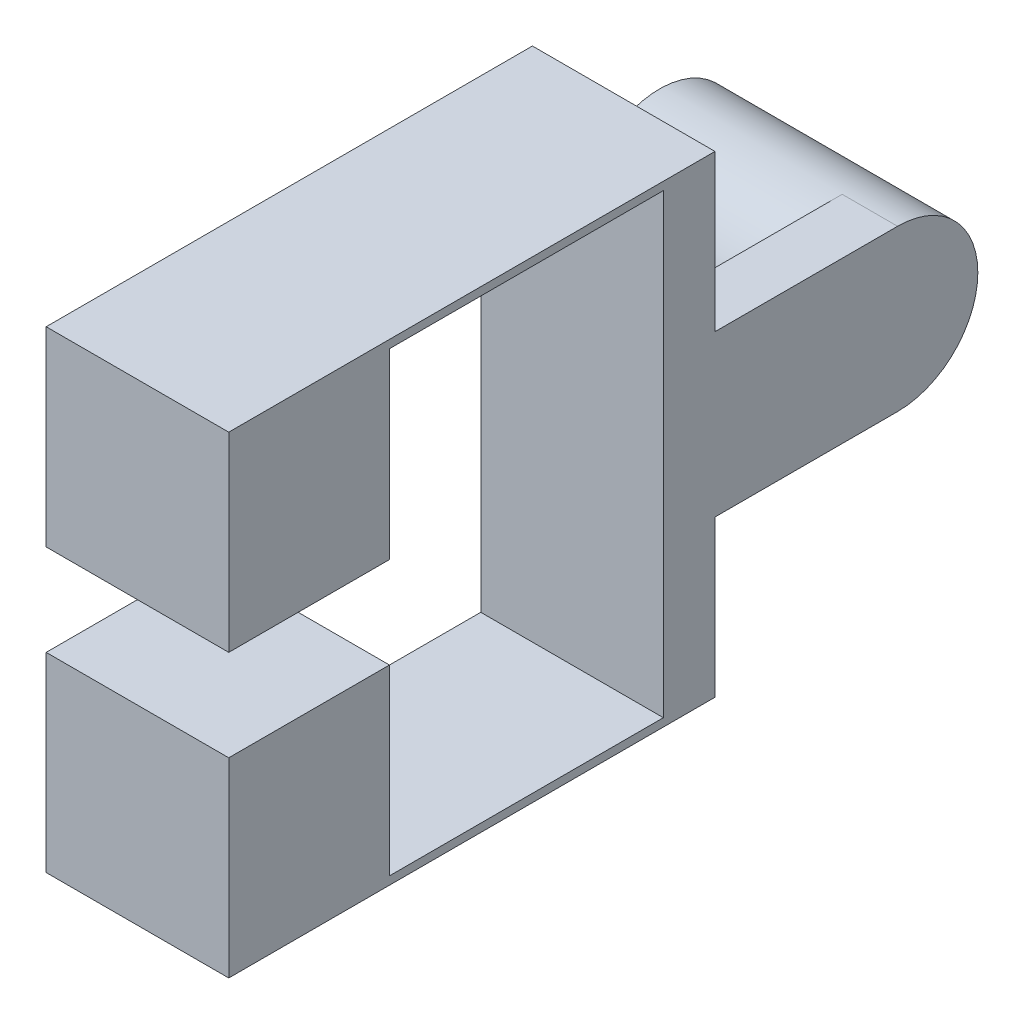
ISO-10303-21;
HEADER;
FILE_DESCRIPTION(('STEP AP214'),'2;1');
FILE_NAME('part.step','',(''),(''),'','','');
FILE_SCHEMA(('AUTOMOTIVE_DESIGN { 1 0 10303 214 1 1 1 1 }'));
ENDSEC;
DATA;
#1=APPLICATION_CONTEXT('core data for automotive mechanical design processes');
#2=APPLICATION_PROTOCOL_DEFINITION('international standard','automotive_design',2000,#1);
#3=PRODUCT_CONTEXT('',#1,'mechanical');
#4=PRODUCT('Part','Part','',(#3));
#5=PRODUCT_RELATED_PRODUCT_CATEGORY('part','',(#4));
#6=PRODUCT_DEFINITION_FORMATION('','',#4);
#7=PRODUCT_DEFINITION_CONTEXT('part definition',#1,'design');
#8=PRODUCT_DEFINITION('design','',#6,#7);
#9=PRODUCT_DEFINITION_SHAPE('','',#8);
#10=(LENGTH_UNIT() NAMED_UNIT(*) SI_UNIT(.MILLI.,.METRE.));
#11=(NAMED_UNIT(*) PLANE_ANGLE_UNIT() SI_UNIT($,.RADIAN.));
#12=(NAMED_UNIT(*) SI_UNIT($,.STERADIAN.) SOLID_ANGLE_UNIT());
#13=UNCERTAINTY_MEASURE_WITH_UNIT(LENGTH_MEASURE(1.E-05),#10,'distance_accuracy_value','');
#14=(GEOMETRIC_REPRESENTATION_CONTEXT(3) GLOBAL_UNCERTAINTY_ASSIGNED_CONTEXT((#13)) GLOBAL_UNIT_ASSIGNED_CONTEXT((#10,
#11,#12)) REPRESENTATION_CONTEXT('',''));
#15=CARTESIAN_POINT('',(0.,0.,0.));
#16=DIRECTION('',(0.,0.,1.));
#17=DIRECTION('',(1.,0.,0.));
#18=AXIS2_PLACEMENT_3D('',#15,#16,#17);
#19=CARTESIAN_POINT('',(7.70606793553884,11.1628049548617,0.));
#20=DIRECTION('',(-1.,0.,0.));
#21=DIRECTION('',(0.,0.,1.));
#22=AXIS2_PLACEMENT_3D('',#19,#20,#21);
#23=CYLINDRICAL_SURFACE('',#22,11.1628049548617);
#24=DIRECTION('',(-1.,0.,0.));
#25=VECTOR('',#24,1.);
#26=CARTESIAN_POINT('',(7.70606793553884,0.,0.));
#27=LINE('',#26,#25);
#28=CARTESIAN_POINT('',(7.70606793553884,0.,0.));
#29=VERTEX_POINT('',#28);
#30=CARTESIAN_POINT('',(0.,0.,0.));
#31=VERTEX_POINT('',#30);
#32=EDGE_CURVE('E267',#29,#31,#27,.T.);
#33=ORIENTED_EDGE('',*,*,#32,.T.);
#34=CARTESIAN_POINT('',(0.,11.1628049548617,0.));
#35=DIRECTION('',(-1.,0.,0.));
#36=DIRECTION('',(0.,0.,1.));
#37=AXIS2_PLACEMENT_3D('',#34,#35,#36);
#38=CIRCLE('',#37,11.1628049548617);
#39=CARTESIAN_POINT('',(0.,22.3256099097234,0.));
#40=VERTEX_POINT('',#39);
#41=EDGE_CURVE('E11',#31,#40,#38,.T.);
#42=ORIENTED_EDGE('',*,*,#41,.T.);
#43=DIRECTION('',(-1.,0.,0.));
#44=VECTOR('',#43,1.);
#45=CARTESIAN_POINT('',(7.70606793553884,22.3256099097234,0.));
#46=LINE('',#45,#44);
#47=CARTESIAN_POINT('',(7.70606793553884,22.3256099097234,0.));
#48=VERTEX_POINT('',#47);
#49=EDGE_CURVE('E42',#48,#40,#46,.T.);
#50=ORIENTED_EDGE('',*,*,#49,.F.);
#51=CARTESIAN_POINT('',(7.70606793553884,11.1628049548617,0.));
#52=DIRECTION('',(1.,0.,0.));
#53=DIRECTION('',(0.,0.,-1.));
#54=AXIS2_PLACEMENT_3D('',#51,#52,#53);
#55=CIRCLE('',#54,11.1628049548617);
#56=EDGE_CURVE('E261',#29,#48,#55,.T.);
#57=ORIENTED_EDGE('',*,*,#56,.F.);
#58=EDGE_LOOP('',(#33,#42,#50,#57));
#59=FACE_BOUND('',#58,.T.);
#60=CARTESIAN_POINT('',(-25.4,11.1628049548617,0.));
#61=DIRECTION('',(-1.,0.,0.));
#62=DIRECTION('',(0.,0.,1.));
#63=AXIS2_PLACEMENT_3D('',#60,#61,#62);
#64=CIRCLE('',#63,11.1628049548617);
#65=CARTESIAN_POINT('',(-25.4,11.1628049548617,11.1628049548617));
#66=VERTEX_POINT('',#65);
#67=EDGE_CURVE('E258',#66,#66,#64,.T.);
#68=ORIENTED_EDGE('',*,*,#67,.F.);
#69=EDGE_LOOP('',(#68));
#70=FACE_BOUND('',#69,.T.);
#71=ADVANCED_FACE('F41',(#59,#70),#23,.T.);
#72=CARTESIAN_POINT('',(7.70606793553884,22.3256099097234,0.));
#73=DIRECTION('',(0.,-1.,0.));
#74=DIRECTION('',(0.,0.,-1.));
#75=AXIS2_PLACEMENT_3D('',#72,#73,#74);
#76=PLANE('',#75);
#77=DIRECTION('',(0.,0.,1.));
#78=VECTOR('',#77,1.);
#79=CARTESIAN_POINT('',(0.,22.3256099097234,0.));
#80=LINE('',#79,#78);
#81=CARTESIAN_POINT('',(0.,22.3256099097234,25.4));
#82=VERTEX_POINT('',#81);
#83=EDGE_CURVE('E259',#40,#82,#80,.T.);
#84=ORIENTED_EDGE('',*,*,#83,.T.);
#85=DIRECTION('',(-1.,0.,0.));
#86=VECTOR('',#85,1.);
#87=CARTESIAN_POINT('',(7.70606793553884,22.3256099097234,25.4));
#88=LINE('',#87,#86);
#89=CARTESIAN_POINT('',(7.70606793553884,22.3256099097234,25.4));
#90=VERTEX_POINT('',#89);
#91=EDGE_CURVE('E278',#90,#82,#88,.T.);
#92=ORIENTED_EDGE('',*,*,#91,.F.);
#93=DIRECTION('',(0.,0.,1.));
#94=VECTOR('',#93,1.);
#95=CARTESIAN_POINT('',(7.70606793553884,22.3256099097234,0.));
#96=LINE('',#95,#94);
#97=EDGE_CURVE('E262',#48,#90,#96,.T.);
#98=ORIENTED_EDGE('',*,*,#97,.F.);
#99=ORIENTED_EDGE('',*,*,#49,.T.);
#100=EDGE_LOOP('',(#84,#92,#98,#99));
#101=FACE_BOUND('',#100,.T.);
#102=ADVANCED_FACE('F289',(#101),#76,.F.);
#103=CARTESIAN_POINT('',(7.70606793553884,0.,0.));
#104=DIRECTION('',(0.,1.,0.));
#105=DIRECTION('',(0.,0.,1.));
#106=AXIS2_PLACEMENT_3D('',#103,#104,#105);
#107=PLANE('',#106);
#108=DIRECTION('',(0.,0.,-1.));
#109=VECTOR('',#108,1.);
#110=CARTESIAN_POINT('',(0.,0.,0.));
#111=LINE('',#110,#109);
#112=CARTESIAN_POINT('',(0.,0.,25.4));
#113=VERTEX_POINT('',#112);
#114=EDGE_CURVE('E264',#113,#31,#111,.T.);
#115=ORIENTED_EDGE('',*,*,#114,.T.);
#116=ORIENTED_EDGE('',*,*,#32,.F.);
#117=DIRECTION('',(0.,0.,-1.));
#118=VECTOR('',#117,1.);
#119=CARTESIAN_POINT('',(7.70606793553884,0.,0.));
#120=LINE('',#119,#118);
#121=CARTESIAN_POINT('',(7.70606793553884,0.,25.4));
#122=VERTEX_POINT('',#121);
#123=EDGE_CURVE('E270',#122,#29,#120,.T.);
#124=ORIENTED_EDGE('',*,*,#123,.F.);
#125=DIRECTION('',(-1.,0.,0.));
#126=VECTOR('',#125,1.);
#127=CARTESIAN_POINT('',(7.70606793553884,0.,25.4));
#128=LINE('',#127,#126);
#129=EDGE_CURVE('E276',#122,#113,#128,.T.);
#130=ORIENTED_EDGE('',*,*,#129,.T.);
#131=EDGE_LOOP('',(#115,#116,#124,#130));
#132=FACE_BOUND('',#131,.T.);
#133=ADVANCED_FACE('F296',(#132),#107,.F.);
#134=CARTESIAN_POINT('',(7.70606793553884,11.1628049548617,0.));
#135=DIRECTION('',(1.,0.,0.));
#136=DIRECTION('',(0.,0.,-1.));
#137=AXIS2_PLACEMENT_3D('',#134,#135,#136);
#138=PLANE('',#137);
#139=ORIENTED_EDGE('',*,*,#56,.T.);
#140=ORIENTED_EDGE('',*,*,#97,.T.);
#141=DIRECTION('',(0.,1.,0.));
#142=VECTOR('',#141,1.);
#143=CARTESIAN_POINT('',(7.70606793553884,-21.7160839340272,25.4));
#144=LINE('',#143,#142);
#145=CARTESIAN_POINT('',(7.70606793553884,44.0416938437506,25.4));
#146=VERTEX_POINT('',#145);
#147=EDGE_CURVE('E247',#90,#146,#144,.T.);
#148=ORIENTED_EDGE('',*,*,#147,.T.);
#149=DIRECTION('',(0.,0.,1.));
#150=VECTOR('',#149,1.);
#151=CARTESIAN_POINT('',(7.70606793553884,44.0416938437506,25.4));
#152=LINE('',#151,#150);
#153=CARTESIAN_POINT('',(7.70606793553884,44.0416938437506,93.0390430114075));
#154=VERTEX_POINT('',#153);
#155=EDGE_CURVE('E248',#146,#154,#152,.T.);
#156=ORIENTED_EDGE('',*,*,#155,.T.);
#157=DIRECTION('',(0.,1.,0.));
#158=VECTOR('',#157,1.);
#159=CARTESIAN_POINT('',(7.70606793553884,44.0416938437506,93.0390430114075));
#160=LINE('',#159,#158);
#161=CARTESIAN_POINT('',(7.70606793553884,17.5128049548617,93.0390430114075));
#162=VERTEX_POINT('',#161);
#163=EDGE_CURVE('E213',#162,#154,#160,.T.);
#164=ORIENTED_EDGE('',*,*,#163,.F.);
#165=DIRECTION('',(0.,0.,-1.));
#166=VECTOR('',#165,1.);
#167=CARTESIAN_POINT('',(7.70606793553884,17.5128049548617,93.0390430114075));
#168=LINE('',#167,#166);
#169=CARTESIAN_POINT('',(7.70606793553884,17.5128049548617,70.6842048968553));
#170=VERTEX_POINT('',#169);
#171=EDGE_CURVE('E199',#162,#170,#168,.T.);
#172=ORIENTED_EDGE('',*,*,#171,.T.);
#173=DIRECTION('',(0.,1.,0.));
#174=VECTOR('',#173,1.);
#175=CARTESIAN_POINT('',(7.70606793553884,44.0416938437506,70.6842048968553));
#176=LINE('',#175,#174);
#177=CARTESIAN_POINT('',(7.70606793553884,42.9128049548617,70.6842048968553));
#178=VERTEX_POINT('',#177);
#179=EDGE_CURVE('E204',#170,#178,#176,.T.);
#180=ORIENTED_EDGE('',*,*,#179,.T.);
#181=DIRECTION('',(0.,0.,-1.));
#182=VECTOR('',#181,1.);
#183=CARTESIAN_POINT('',(7.70606793553884,42.9128049548617,70.6842048968553));
#184=LINE('',#183,#182);
#185=CARTESIAN_POINT('',(7.70606793553884,42.9128049548617,32.5842048968553));
#186=VERTEX_POINT('',#185);
#187=EDGE_CURVE('E235',#178,#186,#184,.T.);
#188=ORIENTED_EDGE('',*,*,#187,.T.);
#189=DIRECTION('',(0.,-1.,0.));
#190=VECTOR('',#189,1.);
#191=CARTESIAN_POINT('',(7.70606793553884,-21.7160839340272,32.5842048968553));
#192=LINE('',#191,#190);
#193=CARTESIAN_POINT('',(7.70606793553884,-20.5871950451383,32.5842048968553));
#194=VERTEX_POINT('',#193);
#195=EDGE_CURVE('E163',#186,#194,#192,.T.);
#196=ORIENTED_EDGE('',*,*,#195,.T.);
#197=DIRECTION('',(0.,0.,-1.));
#198=VECTOR('',#197,1.);
#199=CARTESIAN_POINT('',(7.70606793553884,-20.5871950451383,70.6842048968553));
#200=LINE('',#199,#198);
#201=CARTESIAN_POINT('',(7.70606793553884,-20.5871950451383,70.6842048968553));
#202=VERTEX_POINT('',#201);
#203=EDGE_CURVE('E226',#202,#194,#200,.T.);
#204=ORIENTED_EDGE('',*,*,#203,.F.);
#205=DIRECTION('',(0.,1.,0.));
#206=VECTOR('',#205,1.);
#207=CARTESIAN_POINT('',(7.70606793553884,-21.7160839340272,70.6842048968553));
#208=LINE('',#207,#206);
#209=CARTESIAN_POINT('',(7.70606793553884,4.81280495486169,70.6842048968553));
#210=VERTEX_POINT('',#209);
#211=EDGE_CURVE('E182',#202,#210,#208,.T.);
#212=ORIENTED_EDGE('',*,*,#211,.T.);
#213=DIRECTION('',(0.,0.,-1.));
#214=VECTOR('',#213,1.);
#215=CARTESIAN_POINT('',(7.70606793553884,4.81280495486169,93.0390430114075));
#216=LINE('',#215,#214);
#217=CARTESIAN_POINT('',(7.70606793553884,4.81280495486169,93.0390430114075));
#218=VERTEX_POINT('',#217);
#219=EDGE_CURVE('E194',#218,#210,#216,.T.);
#220=ORIENTED_EDGE('',*,*,#219,.F.);
#221=DIRECTION('',(0.,1.,0.));
#222=VECTOR('',#221,1.);
#223=CARTESIAN_POINT('',(7.70606793553884,-21.7160839340272,93.0390430114075));
#224=LINE('',#223,#222);
#225=CARTESIAN_POINT('',(7.70606793553884,-21.7160839340272,93.0390430114075));
#226=VERTEX_POINT('',#225);
#227=EDGE_CURVE('E175',#226,#218,#224,.T.);
#228=ORIENTED_EDGE('',*,*,#227,.F.);
#229=DIRECTION('',(0.,0.,-1.));
#230=VECTOR('',#229,1.);
#231=CARTESIAN_POINT('',(7.70606793553884,-21.7160839340272,25.4));
#232=LINE('',#231,#230);
#233=CARTESIAN_POINT('',(7.70606793553884,-21.7160839340272,25.4));
#234=VERTEX_POINT('',#233);
#235=EDGE_CURVE('E168',#226,#234,#232,.T.);
#236=ORIENTED_EDGE('',*,*,#235,.T.);
#237=EDGE_CURVE('E250',#234,#122,#144,.T.);
#238=ORIENTED_EDGE('',*,*,#237,.T.);
#239=ORIENTED_EDGE('',*,*,#123,.T.);
#240=EDGE_LOOP('',(#139,#140,#148,#156,#164,#172,#180,#188,#196,#204,#212,#220,#228,#236,#238,#239));
#241=FACE_BOUND('',#240,.T.);
#242=ADVANCED_FACE('F305',(#241),#138,.T.);
#243=CARTESIAN_POINT('',(0.,11.1628049548617,0.));
#244=DIRECTION('',(1.,0.,0.));
#245=DIRECTION('',(0.,0.,-1.));
#246=AXIS2_PLACEMENT_3D('',#243,#244,#245);
#247=PLANE('',#246);
#248=ORIENTED_EDGE('',*,*,#41,.F.);
#249=ORIENTED_EDGE('',*,*,#114,.F.);
#250=DIRECTION('',(0.,-1.,0.));
#251=VECTOR('',#250,1.);
#252=CARTESIAN_POINT('',(0.,0.,25.4));
#253=LINE('',#252,#251);
#254=EDGE_CURVE('E275',#82,#113,#253,.T.);
#255=ORIENTED_EDGE('',*,*,#254,.F.);
#256=ORIENTED_EDGE('',*,*,#83,.F.);
#257=EDGE_LOOP('',(#248,#249,#255,#256));
#258=FACE_BOUND('',#257,.T.);
#259=ADVANCED_FACE('F295',(#258),#247,.F.);
#260=CARTESIAN_POINT('',(-25.4,11.1628049548617,0.));
#261=DIRECTION('',(-1.,0.,0.));
#262=DIRECTION('',(0.,0.,1.));
#263=AXIS2_PLACEMENT_3D('',#260,#261,#262);
#264=PLANE('',#263);
#265=ORIENTED_EDGE('',*,*,#67,.T.);
#266=EDGE_LOOP('',(#265));
#267=FACE_BOUND('',#266,.T.);
#268=ADVANCED_FACE('F360',(#267),#264,.T.);
#269=CARTESIAN_POINT('',(-17.6939320644612,-21.7160839340272,25.4));
#270=DIRECTION('',(0.,0.,-1.));
#271=DIRECTION('',(-1.,0.,0.));
#272=AXIS2_PLACEMENT_3D('',#269,#270,#271);
#273=PLANE('',#272);
#274=ORIENTED_EDGE('',*,*,#129,.F.);
#275=ORIENTED_EDGE('',*,*,#237,.F.);
#276=DIRECTION('',(1.,0.,0.));
#277=VECTOR('',#276,1.);
#278=CARTESIAN_POINT('',(-17.6939320644612,-21.7160839340272,25.4));
#279=LINE('',#278,#277);
#280=CARTESIAN_POINT('',(-17.6939320644612,-21.7160839340272,25.4));
#281=VERTEX_POINT('',#280);
#282=EDGE_CURVE('E243',#281,#234,#279,.T.);
#283=ORIENTED_EDGE('',*,*,#282,.F.);
#284=DIRECTION('',(0.,1.,0.));
#285=VECTOR('',#284,1.);
#286=CARTESIAN_POINT('',(-17.6939320644612,-21.7160839340272,25.4));
#287=LINE('',#286,#285);
#288=CARTESIAN_POINT('',(-17.6939320644612,44.0416938437506,25.4));
#289=VERTEX_POINT('',#288);
#290=EDGE_CURVE('E165',#281,#289,#287,.T.);
#291=ORIENTED_EDGE('',*,*,#290,.T.);
#292=DIRECTION('',(1.,0.,0.));
#293=VECTOR('',#292,1.);
#294=CARTESIAN_POINT('',(-17.6939320644612,44.0416938437506,25.4));
#295=LINE('',#294,#293);
#296=EDGE_CURVE('E251',#289,#146,#295,.T.);
#297=ORIENTED_EDGE('',*,*,#296,.T.);
#298=ORIENTED_EDGE('',*,*,#147,.F.);
#299=ORIENTED_EDGE('',*,*,#91,.T.);
#300=ORIENTED_EDGE('',*,*,#254,.T.);
#301=EDGE_LOOP('',(#274,#275,#283,#291,#297,#298,#299,#300));
#302=FACE_BOUND('',#301,.T.);
#303=ADVANCED_FACE('F298',(#302),#273,.T.);
#304=CARTESIAN_POINT('',(-17.6939320644612,-21.7160839340272,25.4));
#305=DIRECTION('',(0.,-1.,0.));
#306=DIRECTION('',(0.,0.,-1.));
#307=AXIS2_PLACEMENT_3D('',#304,#305,#306);
#308=PLANE('',#307);
#309=ORIENTED_EDGE('',*,*,#235,.F.);
#310=DIRECTION('',(1.,0.,0.));
#311=VECTOR('',#310,1.);
#312=CARTESIAN_POINT('',(-17.6939320644612,-21.7160839340272,93.0390430114075));
#313=LINE('',#312,#311);
#314=CARTESIAN_POINT('',(-17.6939320644612,-21.7160839340272,93.0390430114075));
#315=VERTEX_POINT('',#314);
#316=EDGE_CURVE('E170',#315,#226,#313,.T.);
#317=ORIENTED_EDGE('',*,*,#316,.F.);
#318=DIRECTION('',(0.,0.,-1.));
#319=VECTOR('',#318,1.);
#320=CARTESIAN_POINT('',(-17.6939320644612,-21.7160839340272,25.4));
#321=LINE('',#320,#319);
#322=EDGE_CURVE('E152',#315,#281,#321,.T.);
#323=ORIENTED_EDGE('',*,*,#322,.T.);
#324=ORIENTED_EDGE('',*,*,#282,.T.);
#325=EDGE_LOOP('',(#309,#317,#323,#324));
#326=FACE_BOUND('',#325,.T.);
#327=ADVANCED_FACE('F169',(#326),#308,.T.);
#328=CARTESIAN_POINT('',(-17.6939320644612,-21.7160839340272,32.5842048968553));
#329=DIRECTION('',(0.,0.,1.));
#330=DIRECTION('',(1.,0.,0.));
#331=AXIS2_PLACEMENT_3D('',#328,#329,#330);
#332=PLANE('',#331);
#333=DIRECTION('',(-1.,0.,0.));
#334=VECTOR('',#333,1.);
#335=CARTESIAN_POINT('',(7.70606793553884,-20.5871950451383,32.5842048968553));
#336=LINE('',#335,#334);
#337=CARTESIAN_POINT('',(-17.6939320644612,-20.5871950451383,32.5842048968553));
#338=VERTEX_POINT('',#337);
#339=EDGE_CURVE('E64',#194,#338,#336,.T.);
#340=ORIENTED_EDGE('',*,*,#339,.F.);
#341=ORIENTED_EDGE('',*,*,#195,.F.);
#342=DIRECTION('',(1.,0.,0.));
#343=VECTOR('',#342,1.);
#344=CARTESIAN_POINT('',(-17.6939320644612,42.9128049548617,32.5842048968553));
#345=LINE('',#344,#343);
#346=CARTESIAN_POINT('',(-17.6939320644612,42.9128049548617,32.5842048968553));
#347=VERTEX_POINT('',#346);
#348=EDGE_CURVE('E57',#347,#186,#345,.T.);
#349=ORIENTED_EDGE('',*,*,#348,.F.);
#350=DIRECTION('',(0.,-1.,0.));
#351=VECTOR('',#350,1.);
#352=CARTESIAN_POINT('',(-17.6939320644612,-21.7160839340272,32.5842048968553));
#353=LINE('',#352,#351);
#354=EDGE_CURVE('E241',#347,#338,#353,.T.);
#355=ORIENTED_EDGE('',*,*,#354,.T.);
#356=EDGE_LOOP('',(#340,#341,#349,#355));
#357=FACE_BOUND('',#356,.T.);
#358=ADVANCED_FACE('F314',(#357),#332,.T.);
#359=CARTESIAN_POINT('',(-17.6939320644612,44.0416938437506,25.4));
#360=DIRECTION('',(0.,1.,0.));
#361=DIRECTION('',(0.,0.,1.));
#362=AXIS2_PLACEMENT_3D('',#359,#360,#361);
#363=PLANE('',#362);
#364=ORIENTED_EDGE('',*,*,#155,.F.);
#365=ORIENTED_EDGE('',*,*,#296,.F.);
#366=DIRECTION('',(0.,0.,1.));
#367=VECTOR('',#366,1.);
#368=CARTESIAN_POINT('',(-17.6939320644612,44.0416938437506,25.4));
#369=LINE('',#368,#367);
#370=CARTESIAN_POINT('',(-17.6939320644612,44.0416938437506,93.0390430114075));
#371=VERTEX_POINT('',#370);
#372=EDGE_CURVE('E238',#289,#371,#369,.T.);
#373=ORIENTED_EDGE('',*,*,#372,.T.);
#374=DIRECTION('',(-1.,0.,0.));
#375=VECTOR('',#374,1.);
#376=CARTESIAN_POINT('',(-17.6939320644612,44.0416938437506,93.0390430114075));
#377=LINE('',#376,#375);
#378=EDGE_CURVE('E201',#154,#371,#377,.T.);
#379=ORIENTED_EDGE('',*,*,#378,.F.);
#380=EDGE_LOOP('',(#364,#365,#373,#379));
#381=FACE_BOUND('',#380,.T.);
#382=ADVANCED_FACE('F331',(#381),#363,.T.);
#383=CARTESIAN_POINT('',(-17.6939320644612,0.,0.));
#384=DIRECTION('',(-1.,0.,0.));
#385=DIRECTION('',(0.,0.,1.));
#386=AXIS2_PLACEMENT_3D('',#383,#384,#385);
#387=PLANE('',#386);
#388=ORIENTED_EDGE('',*,*,#322,.F.);
#389=DIRECTION('',(0.,-1.,0.));
#390=VECTOR('',#389,1.);
#391=CARTESIAN_POINT('',(-17.6939320644612,-21.7160839340272,93.0390430114075));
#392=LINE('',#391,#390);
#393=CARTESIAN_POINT('',(-17.6939320644612,4.81280495486169,93.0390430114075));
#394=VERTEX_POINT('',#393);
#395=EDGE_CURVE('E157',#394,#315,#392,.T.);
#396=ORIENTED_EDGE('',*,*,#395,.F.);
#397=DIRECTION('',(0.,0.,-1.));
#398=VECTOR('',#397,1.);
#399=CARTESIAN_POINT('',(-17.6939320644612,4.81280495486169,93.0390430114075));
#400=LINE('',#399,#398);
#401=CARTESIAN_POINT('',(-17.6939320644612,4.81280495486169,70.6842048968553));
#402=VERTEX_POINT('',#401);
#403=EDGE_CURVE('E189',#394,#402,#400,.T.);
#404=ORIENTED_EDGE('',*,*,#403,.T.);
#405=DIRECTION('',(0.,-1.,0.));
#406=VECTOR('',#405,1.);
#407=CARTESIAN_POINT('',(-17.6939320644612,-21.7160839340272,70.6842048968553));
#408=LINE('',#407,#406);
#409=CARTESIAN_POINT('',(-17.6939320644612,-20.5871950451383,70.6842048968553));
#410=VERTEX_POINT('',#409);
#411=EDGE_CURVE('E186',#402,#410,#408,.T.);
#412=ORIENTED_EDGE('',*,*,#411,.T.);
#413=DIRECTION('',(0.,0.,-1.));
#414=VECTOR('',#413,1.);
#415=CARTESIAN_POINT('',(-17.6939320644612,-20.5871950451383,70.6842048968553));
#416=LINE('',#415,#414);
#417=EDGE_CURVE('E224',#410,#338,#416,.T.);
#418=ORIENTED_EDGE('',*,*,#417,.T.);
#419=ORIENTED_EDGE('',*,*,#354,.F.);
#420=DIRECTION('',(0.,0.,-1.));
#421=VECTOR('',#420,1.);
#422=CARTESIAN_POINT('',(-17.6939320644612,42.9128049548617,70.6842048968553));
#423=LINE('',#422,#421);
#424=CARTESIAN_POINT('',(-17.6939320644612,42.9128049548617,70.6842048968553));
#425=VERTEX_POINT('',#424);
#426=EDGE_CURVE('E198',#425,#347,#423,.T.);
#427=ORIENTED_EDGE('',*,*,#426,.F.);
#428=DIRECTION('',(0.,-1.,0.));
#429=VECTOR('',#428,1.);
#430=CARTESIAN_POINT('',(-17.6939320644612,44.0416938437506,70.6842048968553));
#431=LINE('',#430,#429);
#432=CARTESIAN_POINT('',(-17.6939320644612,17.5128049548617,70.6842048968553));
#433=VERTEX_POINT('',#432);
#434=EDGE_CURVE('E187',#425,#433,#431,.T.);
#435=ORIENTED_EDGE('',*,*,#434,.T.);
#436=DIRECTION('',(0.,0.,-1.));
#437=VECTOR('',#436,1.);
#438=CARTESIAN_POINT('',(-17.6939320644612,17.5128049548617,93.0390430114075));
#439=LINE('',#438,#437);
#440=CARTESIAN_POINT('',(-17.6939320644612,17.5128049548617,93.0390430114075));
#441=VERTEX_POINT('',#440);
#442=EDGE_CURVE('E197',#441,#433,#439,.T.);
#443=ORIENTED_EDGE('',*,*,#442,.F.);
#444=DIRECTION('',(0.,-1.,0.));
#445=VECTOR('',#444,1.);
#446=CARTESIAN_POINT('',(-17.6939320644612,44.0416938437506,93.0390430114075));
#447=LINE('',#446,#445);
#448=EDGE_CURVE('E208',#371,#441,#447,.T.);
#449=ORIENTED_EDGE('',*,*,#448,.F.);
#450=ORIENTED_EDGE('',*,*,#372,.F.);
#451=ORIENTED_EDGE('',*,*,#290,.F.);
#452=EDGE_LOOP('',(#388,#396,#404,#412,#418,#419,#427,#435,#443,#449,#450,#451));
#453=FACE_BOUND('',#452,.T.);
#454=ADVANCED_FACE('F156',(#453),#387,.T.);
#455=CARTESIAN_POINT('',(-17.6939320644612,42.9128049548617,70.6842048968553));
#456=DIRECTION('',(0.,1.,0.));
#457=DIRECTION('',(0.,0.,1.));
#458=AXIS2_PLACEMENT_3D('',#455,#456,#457);
#459=PLANE('',#458);
#460=ORIENTED_EDGE('',*,*,#348,.T.);
#461=ORIENTED_EDGE('',*,*,#187,.F.);
#462=DIRECTION('',(1.,0.,0.));
#463=VECTOR('',#462,1.);
#464=CARTESIAN_POINT('',(-17.6939320644612,42.9128049548617,70.6842048968553));
#465=LINE('',#464,#463);
#466=EDGE_CURVE('E233',#425,#178,#465,.T.);
#467=ORIENTED_EDGE('',*,*,#466,.F.);
#468=ORIENTED_EDGE('',*,*,#426,.T.);
#469=EDGE_LOOP('',(#460,#461,#467,#468));
#470=FACE_BOUND('',#469,.T.);
#471=ADVANCED_FACE('F316',(#470),#459,.F.);
#472=CARTESIAN_POINT('',(7.70606793553884,-20.5871950451383,70.6842048968553));
#473=DIRECTION('',(0.,-1.,0.));
#474=DIRECTION('',(0.,0.,-1.));
#475=AXIS2_PLACEMENT_3D('',#472,#473,#474);
#476=PLANE('',#475);
#477=ORIENTED_EDGE('',*,*,#339,.T.);
#478=ORIENTED_EDGE('',*,*,#417,.F.);
#479=DIRECTION('',(-1.,0.,0.));
#480=VECTOR('',#479,1.);
#481=CARTESIAN_POINT('',(7.70606793553884,-20.5871950451383,70.6842048968553));
#482=LINE('',#481,#480);
#483=EDGE_CURVE('E219',#202,#410,#482,.T.);
#484=ORIENTED_EDGE('',*,*,#483,.F.);
#485=ORIENTED_EDGE('',*,*,#203,.T.);
#486=EDGE_LOOP('',(#477,#478,#484,#485));
#487=FACE_BOUND('',#486,.T.);
#488=ADVANCED_FACE('F311',(#487),#476,.F.);
#489=CARTESIAN_POINT('',(-17.6939320644612,4.81280495486169,93.0390430114075));
#490=DIRECTION('',(0.,-1.,0.));
#491=DIRECTION('',(0.,0.,-1.));
#492=AXIS2_PLACEMENT_3D('',#489,#490,#491);
#493=PLANE('',#492);
#494=DIRECTION('',(-1.,0.,0.));
#495=VECTOR('',#494,1.);
#496=CARTESIAN_POINT('',(-17.6939320644612,4.81280495486169,70.6842048968553));
#497=LINE('',#496,#495);
#498=EDGE_CURVE('E176',#210,#402,#497,.T.);
#499=ORIENTED_EDGE('',*,*,#498,.T.);
#500=ORIENTED_EDGE('',*,*,#403,.F.);
#501=DIRECTION('',(-1.,0.,0.));
#502=VECTOR('',#501,1.);
#503=CARTESIAN_POINT('',(-17.6939320644612,4.81280495486169,93.0390430114075));
#504=LINE('',#503,#502);
#505=EDGE_CURVE('E180',#218,#394,#504,.T.);
#506=ORIENTED_EDGE('',*,*,#505,.F.);
#507=ORIENTED_EDGE('',*,*,#219,.T.);
#508=EDGE_LOOP('',(#499,#500,#506,#507));
#509=FACE_BOUND('',#508,.T.);
#510=ADVANCED_FACE('F306',(#509),#493,.F.);
#511=CARTESIAN_POINT('',(0.,0.,93.0390430114075));
#512=DIRECTION('',(0.,0.,-1.));
#513=DIRECTION('',(-1.,0.,0.));
#514=AXIS2_PLACEMENT_3D('',#511,#512,#513);
#515=PLANE('',#514);
#516=ORIENTED_EDGE('',*,*,#395,.T.);
#517=ORIENTED_EDGE('',*,*,#316,.T.);
#518=ORIENTED_EDGE('',*,*,#227,.T.);
#519=ORIENTED_EDGE('',*,*,#505,.T.);
#520=EDGE_LOOP('',(#516,#517,#518,#519));
#521=FACE_BOUND('',#520,.T.);
#522=ADVANCED_FACE('F172',(#521),#515,.F.);
#523=CARTESIAN_POINT('',(0.,0.,70.6842048968553));
#524=DIRECTION('',(0.,0.,-1.));
#525=DIRECTION('',(-1.,0.,0.));
#526=AXIS2_PLACEMENT_3D('',#523,#524,#525);
#527=PLANE('',#526);
#528=ORIENTED_EDGE('',*,*,#211,.F.);
#529=ORIENTED_EDGE('',*,*,#483,.T.);
#530=ORIENTED_EDGE('',*,*,#411,.F.);
#531=ORIENTED_EDGE('',*,*,#498,.F.);
#532=EDGE_LOOP('',(#528,#529,#530,#531));
#533=FACE_BOUND('',#532,.T.);
#534=ADVANCED_FACE('F313',(#533),#527,.T.);
#535=CARTESIAN_POINT('',(0.,0.,70.6842048968553));
#536=DIRECTION('',(0.,0.,1.));
#537=DIRECTION('',(1.,0.,0.));
#538=AXIS2_PLACEMENT_3D('',#535,#536,#537);
#539=PLANE('',#538);
#540=ORIENTED_EDGE('',*,*,#434,.F.);
#541=ORIENTED_EDGE('',*,*,#466,.T.);
#542=ORIENTED_EDGE('',*,*,#179,.F.);
#543=DIRECTION('',(1.,0.,0.));
#544=VECTOR('',#543,1.);
#545=CARTESIAN_POINT('',(-17.6939320644612,17.5128049548617,70.6842048968553));
#546=LINE('',#545,#544);
#547=EDGE_CURVE('E210',#433,#170,#546,.T.);
#548=ORIENTED_EDGE('',*,*,#547,.F.);
#549=EDGE_LOOP('',(#540,#541,#542,#548));
#550=FACE_BOUND('',#549,.T.);
#551=ADVANCED_FACE('F325',(#550),#539,.F.);
#552=CARTESIAN_POINT('',(-17.6939320644612,17.5128049548617,93.0390430114075));
#553=DIRECTION('',(0.,1.,0.));
#554=DIRECTION('',(0.,0.,1.));
#555=AXIS2_PLACEMENT_3D('',#552,#553,#554);
#556=PLANE('',#555);
#557=ORIENTED_EDGE('',*,*,#547,.T.);
#558=ORIENTED_EDGE('',*,*,#171,.F.);
#559=DIRECTION('',(1.,0.,0.));
#560=VECTOR('',#559,1.);
#561=CARTESIAN_POINT('',(-17.6939320644612,17.5128049548617,93.0390430114075));
#562=LINE('',#561,#560);
#563=EDGE_CURVE('E216',#441,#162,#562,.T.);
#564=ORIENTED_EDGE('',*,*,#563,.F.);
#565=ORIENTED_EDGE('',*,*,#442,.T.);
#566=EDGE_LOOP('',(#557,#558,#564,#565));
#567=FACE_BOUND('',#566,.T.);
#568=ADVANCED_FACE('F326',(#567),#556,.F.);
#569=CARTESIAN_POINT('',(0.,0.,93.0390430114075));
#570=DIRECTION('',(0.,0.,1.));
#571=DIRECTION('',(1.,0.,0.));
#572=AXIS2_PLACEMENT_3D('',#569,#570,#571);
#573=PLANE('',#572);
#574=ORIENTED_EDGE('',*,*,#448,.T.);
#575=ORIENTED_EDGE('',*,*,#563,.T.);
#576=ORIENTED_EDGE('',*,*,#163,.T.);
#577=ORIENTED_EDGE('',*,*,#378,.T.);
#578=EDGE_LOOP('',(#574,#575,#576,#577));
#579=FACE_BOUND('',#578,.T.);
#580=ADVANCED_FACE('F328',(#579),#573,.T.);
#581=CLOSED_SHELL('',(#71,#102,#133,#242,#259,#268,#303,#327,#358,#382,#454,#471,#488,#510,#522,
#534,#551,#568,#580));
#582=MANIFOLD_SOLID_BREP('B2',#581);
#583=ADVANCED_BREP_SHAPE_REPRESENTATION('',(#18,#582),#14);
#584=SHAPE_DEFINITION_REPRESENTATION(#9,#583);
ENDSEC;
END-ISO-10303-21;
